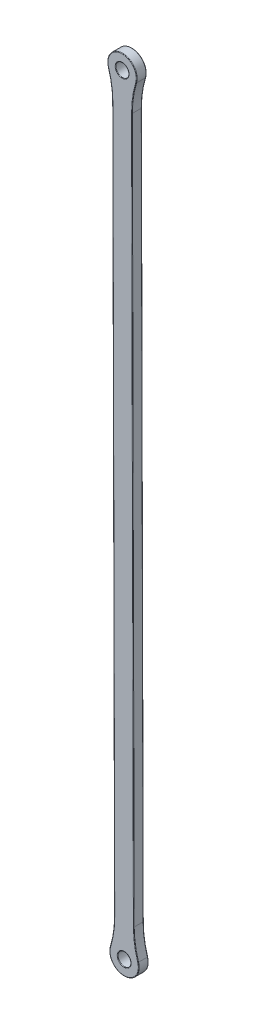
ISO-10303-21;
HEADER;
FILE_DESCRIPTION(('STEP AP214'),'2;1');
FILE_NAME('part.step','',(''),(''),'','','');
FILE_SCHEMA(('AUTOMOTIVE_DESIGN { 1 0 10303 214 1 1 1 1 }'));
ENDSEC;
DATA;
#1=APPLICATION_CONTEXT('core data for automotive mechanical design processes');
#2=APPLICATION_PROTOCOL_DEFINITION('international standard','automotive_design',2000,#1);
#3=PRODUCT_CONTEXT('',#1,'mechanical');
#4=PRODUCT('Part','Part','',(#3));
#5=PRODUCT_RELATED_PRODUCT_CATEGORY('part','',(#4));
#6=PRODUCT_DEFINITION_FORMATION('','',#4);
#7=PRODUCT_DEFINITION_CONTEXT('part definition',#1,'design');
#8=PRODUCT_DEFINITION('design','',#6,#7);
#9=PRODUCT_DEFINITION_SHAPE('','',#8);
#10=(LENGTH_UNIT() NAMED_UNIT(*) SI_UNIT(.MILLI.,.METRE.));
#11=(NAMED_UNIT(*) PLANE_ANGLE_UNIT() SI_UNIT($,.RADIAN.));
#12=(NAMED_UNIT(*) SI_UNIT($,.STERADIAN.) SOLID_ANGLE_UNIT());
#13=UNCERTAINTY_MEASURE_WITH_UNIT(LENGTH_MEASURE(1.E-05),#10,'distance_accuracy_value','');
#14=(GEOMETRIC_REPRESENTATION_CONTEXT(3) GLOBAL_UNCERTAINTY_ASSIGNED_CONTEXT((#13)) GLOBAL_UNIT_ASSIGNED_CONTEXT((#10,
#11,#12)) REPRESENTATION_CONTEXT('',''));
#15=CARTESIAN_POINT('',(0.,0.,0.));
#16=DIRECTION('',(0.,0.,1.));
#17=DIRECTION('',(1.,0.,0.));
#18=AXIS2_PLACEMENT_3D('',#15,#16,#17);
#19=CARTESIAN_POINT('',(11.4805483064947,0.0304454842710999,-3.));
#20=DIRECTION('',(0.999996483681336,0.00265190968255863,0.));
#21=DIRECTION('',(-0.00265190968255863,0.999996483681336,0.));
#22=AXIS2_PLACEMENT_3D('',#19,#20,#21);
#23=PLANE('',#22);
#24=DIRECTION('',(0.,0.,1.));
#25=VECTOR('',#24,1.);
#26=CARTESIAN_POINT('',(11.473326205843,2.75379436149719,-3.));
#27=LINE('',#26,#25);
#28=CARTESIAN_POINT('',(11.473326205843,2.75379436149719,-2.85));
#29=VERTEX_POINT('',#28);
#30=CARTESIAN_POINT('',(11.473326205843,2.75379436149719,-0.15));
#31=VERTEX_POINT('',#30);
#32=EDGE_CURVE('E302',#29,#31,#27,.T.);
#33=ORIENTED_EDGE('',*,*,#32,.T.);
#34=DIRECTION('',(-0.00265190968255863,0.999996483681336,0.));
#35=VECTOR('',#34,1.);
#36=CARTESIAN_POINT('',(10.8987204377385,219.429253328547,-0.15));
#37=LINE('',#36,#35);
#38=CARTESIAN_POINT('',(10.8987204377385,219.429253328547,-0.15));
#39=VERTEX_POINT('',#38);
#40=EDGE_CURVE('E209',#31,#39,#37,.T.);
#41=ORIENTED_EDGE('',*,*,#40,.T.);
#42=DIRECTION('',(0.,0.,1.));
#43=VECTOR('',#42,1.);
#44=CARTESIAN_POINT('',(10.8987204377385,219.429253328547,-3.));
#45=LINE('',#44,#43);
#46=CARTESIAN_POINT('',(10.8987204377385,219.429253328547,-2.85));
#47=VERTEX_POINT('',#46);
#48=EDGE_CURVE('E296',#39,#47,#45,.F.);
#49=ORIENTED_EDGE('',*,*,#48,.T.);
#50=DIRECTION('',(-0.00265190968255863,0.999996483681336,0.));
#51=VECTOR('',#50,1.);
#52=CARTESIAN_POINT('',(11.4805483064947,0.0304454842710999,-2.85));
#53=LINE('',#52,#51);
#54=EDGE_CURVE('E207',#47,#29,#53,.F.);
#55=ORIENTED_EDGE('',*,*,#54,.T.);
#56=EDGE_LOOP('',(#33,#41,#49,#55));
#57=FACE_BOUND('',#56,.T.);
#58=ADVANCED_FACE('F34',(#57),#23,.F.);
#59=CARTESIAN_POINT('',(13.8720255623407,229.49947957407,-3.));
#60=DIRECTION('',(0.,0.,1.));
#61=DIRECTION('',(1.,0.,0.));
#62=AXIS2_PLACEMENT_3D('',#59,#60,#61);
#63=CYLINDRICAL_SURFACE('',#62,4.50000000000002);
#64=DIRECTION('',(0.,0.,1.));
#65=VECTOR('',#64,1.);
#66=CARTESIAN_POINT('',(9.57117343603082,228.175594765026,-3.));
#67=LINE('',#66,#65);
#68=CARTESIAN_POINT('',(9.57117343603082,228.175594765026,-2.85));
#69=VERTEX_POINT('',#68);
#70=CARTESIAN_POINT('',(9.57117343603082,228.175594765026,-0.15));
#71=VERTEX_POINT('',#70);
#72=EDGE_CURVE('E298',#69,#71,#67,.T.);
#73=ORIENTED_EDGE('',*,*,#72,.T.);
#74=CARTESIAN_POINT('',(13.8720255623407,229.49947957407,-0.15));
#75=DIRECTION('',(0.,0.,1.));
#76=DIRECTION('',(1.,0.,0.));
#77=AXIS2_PLACEMENT_3D('',#74,#75,#76);
#78=CIRCLE('',#77,4.50000000000002);
#79=CARTESIAN_POINT('',(18.1798388172876,228.198424248381,-0.15));
#80=VERTEX_POINT('',#79);
#81=EDGE_CURVE('E184',#71,#80,#78,.F.);
#82=ORIENTED_EDGE('',*,*,#81,.T.);
#83=DIRECTION('',(0.,0.,1.));
#84=VECTOR('',#83,1.);
#85=CARTESIAN_POINT('',(18.1798388172876,228.198424248381,-3.));
#86=LINE('',#85,#84);
#87=CARTESIAN_POINT('',(18.1798388172876,228.198424248381,-2.85));
#88=VERTEX_POINT('',#87);
#89=EDGE_CURVE('E305',#80,#88,#86,.F.);
#90=ORIENTED_EDGE('',*,*,#89,.T.);
#91=CARTESIAN_POINT('',(13.8720255623407,229.49947957407,-2.85));
#92=DIRECTION('',(0.,0.,1.));
#93=DIRECTION('',(1.,0.,0.));
#94=AXIS2_PLACEMENT_3D('',#91,#92,#93);
#95=CIRCLE('',#94,4.50000000000002);
#96=EDGE_CURVE('E182',#88,#69,#95,.T.);
#97=ORIENTED_EDGE('',*,*,#96,.T.);
#98=EDGE_LOOP('',(#73,#82,#90,#97));
#99=FACE_BOUND('',#98,.T.);
#100=ADVANCED_FACE('F338',(#99),#63,.T.);
#101=CARTESIAN_POINT('',(17.4805272085827,0.046356942366452,-3.));
#102=DIRECTION('',(0.999996483681336,0.00265190968255864,0.));
#103=DIRECTION('',(-0.00265190968255864,0.999996483681336,0.));
#104=AXIS2_PLACEMENT_3D('',#101,#102,#103);
#105=PLANE('',#104);
#106=DIRECTION('',(0.,0.,-1.));
#107=VECTOR('',#106,1.);
#108=CARTESIAN_POINT('',(16.8986993398265,219.445164786642,0.));
#109=LINE('',#108,#107);
#110=CARTESIAN_POINT('',(16.8986993398265,219.445164786642,-2.85));
#111=VERTEX_POINT('',#110);
#112=CARTESIAN_POINT('',(16.8986993398265,219.445164786642,-0.15));
#113=VERTEX_POINT('',#112);
#114=EDGE_CURVE('E308',#111,#113,#109,.F.);
#115=ORIENTED_EDGE('',*,*,#114,.T.);
#116=DIRECTION('',(-0.00265190968255864,0.999996483681336,0.));
#117=VECTOR('',#116,1.);
#118=CARTESIAN_POINT('',(17.4805272085827,0.046356942366452,-0.15));
#119=LINE('',#118,#117);
#120=CARTESIAN_POINT('',(17.473305107931,2.76970581959246,-0.15));
#121=VERTEX_POINT('',#120);
#122=EDGE_CURVE('E192',#113,#121,#119,.F.);
#123=ORIENTED_EDGE('',*,*,#122,.T.);
#124=DIRECTION('',(0.,0.,-1.));
#125=VECTOR('',#124,1.);
#126=CARTESIAN_POINT('',(17.473305107931,2.76970581959246,-3.));
#127=LINE('',#126,#125);
#128=CARTESIAN_POINT('',(17.473305107931,2.76970581959246,-2.85));
#129=VERTEX_POINT('',#128);
#130=EDGE_CURVE('E303',#121,#129,#127,.T.);
#131=ORIENTED_EDGE('',*,*,#130,.T.);
#132=DIRECTION('',(-0.00265190968255864,0.999996483681336,0.));
#133=VECTOR('',#132,1.);
#134=CARTESIAN_POINT('',(16.8986993398265,219.445164786642,-2.85));
#135=LINE('',#134,#133);
#136=EDGE_CURVE('E190',#129,#111,#135,.T.);
#137=ORIENTED_EDGE('',*,*,#136,.T.);
#138=EDGE_LOOP('',(#115,#123,#131,#137));
#139=FACE_BOUND('',#138,.T.);
#140=ADVANCED_FACE('F382',(#139),#105,.T.);
#141=CARTESIAN_POINT('',(13.8720255623407,229.49947957407,-3.));
#142=DIRECTION('',(0.,0.,1.));
#143=DIRECTION('',(1.,0.,0.));
#144=AXIS2_PLACEMENT_3D('',#141,#142,#143);
#145=CYLINDRICAL_SURFACE('',#144,2.);
#146=CARTESIAN_POINT('',(13.8720255623407,229.49947957407,-0.15));
#147=DIRECTION('',(0.,0.,1.));
#148=DIRECTION('',(1.,0.,0.));
#149=AXIS2_PLACEMENT_3D('',#146,#147,#148);
#150=CIRCLE('',#149,2.);
#151=CARTESIAN_POINT('',(15.8720255623407,229.49947957407,-0.15));
#152=VERTEX_POINT('',#151);
#153=EDGE_CURVE('E214',#152,#152,#150,.T.);
#154=ORIENTED_EDGE('',*,*,#153,.T.);
#155=EDGE_LOOP('',(#154));
#156=FACE_BOUND('',#155,.T.);
#157=CARTESIAN_POINT('',(13.8720255623407,229.49947957407,-2.85));
#158=DIRECTION('',(0.,0.,1.));
#159=DIRECTION('',(1.,0.,0.));
#160=AXIS2_PLACEMENT_3D('',#157,#158,#159);
#161=CIRCLE('',#160,2.);
#162=CARTESIAN_POINT('',(15.8720255623407,229.49947957407,-2.85));
#163=VERTEX_POINT('',#162);
#164=EDGE_CURVE('E211',#163,#163,#161,.F.);
#165=ORIENTED_EDGE('',*,*,#164,.T.);
#166=EDGE_LOOP('',(#165));
#167=FACE_BOUND('',#166,.T.);
#168=ADVANCED_FACE('F415',(#156,#167),#145,.F.);
#169=CARTESIAN_POINT('',(14.4999999833287,-7.30052042593024,-3.));
#170=DIRECTION('',(0.,0.,1.));
#171=DIRECTION('',(1.,0.,0.));
#172=AXIS2_PLACEMENT_3D('',#169,#170,#171);
#173=CYLINDRICAL_SURFACE('',#172,2.);
#174=CARTESIAN_POINT('',(14.4999999833287,-7.30052042593024,-0.15));
#175=DIRECTION('',(0.,0.,1.));
#176=DIRECTION('',(1.,0.,0.));
#177=AXIS2_PLACEMENT_3D('',#174,#175,#176);
#178=CIRCLE('',#177,2.);
#179=CARTESIAN_POINT('',(16.4999999833287,-7.30052042593024,-0.15));
#180=VERTEX_POINT('',#179);
#181=EDGE_CURVE('E220',#180,#180,#178,.T.);
#182=ORIENTED_EDGE('',*,*,#181,.T.);
#183=EDGE_LOOP('',(#182));
#184=FACE_BOUND('',#183,.T.);
#185=CARTESIAN_POINT('',(14.4999999833287,-7.30052042593024,-2.85));
#186=DIRECTION('',(0.,0.,1.));
#187=DIRECTION('',(1.,0.,0.));
#188=AXIS2_PLACEMENT_3D('',#185,#186,#187);
#189=CIRCLE('',#188,2.);
#190=CARTESIAN_POINT('',(16.4999999833287,-7.30052042593024,-2.85));
#191=VERTEX_POINT('',#190);
#192=EDGE_CURVE('E217',#191,#191,#189,.F.);
#193=ORIENTED_EDGE('',*,*,#192,.T.);
#194=EDGE_LOOP('',(#193));
#195=FACE_BOUND('',#194,.T.);
#196=ADVANCED_FACE('F418',(#184,#195),#173,.F.);
#197=CARTESIAN_POINT('',(14.4999999833287,-7.30052042593024,-3.));
#198=DIRECTION('',(0.,0.,1.));
#199=DIRECTION('',(1.,0.,0.));
#200=AXIS2_PLACEMENT_3D('',#197,#198,#199);
#201=CYLINDRICAL_SURFACE('',#200,4.50000000000001);
#202=DIRECTION('',(0.,0.,1.));
#203=VECTOR('',#202,1.);
#204=CARTESIAN_POINT('',(18.8008521096386,-5.97663561688683,-3.));
#205=LINE('',#204,#203);
#206=CARTESIAN_POINT('',(18.8008521096386,-5.97663561688683,-2.85));
#207=VERTEX_POINT('',#206);
#208=CARTESIAN_POINT('',(18.8008521096386,-5.97663561688683,-0.15));
#209=VERTEX_POINT('',#208);
#210=EDGE_CURVE('E371',#207,#209,#205,.T.);
#211=ORIENTED_EDGE('',*,*,#210,.T.);
#212=CARTESIAN_POINT('',(14.4999999833287,-7.30052042593024,-0.15));
#213=DIRECTION('',(0.,0.,1.));
#214=DIRECTION('',(1.,0.,0.));
#215=AXIS2_PLACEMENT_3D('',#212,#213,#214);
#216=CIRCLE('',#215,4.50000000000001);
#217=CARTESIAN_POINT('',(10.1921867283819,-5.99946510024102,-0.15));
#218=VERTEX_POINT('',#217);
#219=EDGE_CURVE('E201',#209,#218,#216,.F.);
#220=ORIENTED_EDGE('',*,*,#219,.T.);
#221=DIRECTION('',(0.,0.,1.));
#222=VECTOR('',#221,1.);
#223=CARTESIAN_POINT('',(10.1921867283819,-5.99946510024102,-3.));
#224=LINE('',#223,#222);
#225=CARTESIAN_POINT('',(10.1921867283819,-5.99946510024102,-2.85));
#226=VERTEX_POINT('',#225);
#227=EDGE_CURVE('E258',#218,#226,#224,.F.);
#228=ORIENTED_EDGE('',*,*,#227,.T.);
#229=CARTESIAN_POINT('',(14.4999999833287,-7.30052042593024,-2.85));
#230=DIRECTION('',(0.,0.,1.));
#231=DIRECTION('',(1.,0.,0.));
#232=AXIS2_PLACEMENT_3D('',#229,#230,#231);
#233=CIRCLE('',#232,4.50000000000001);
#234=EDGE_CURVE('E199',#226,#207,#233,.T.);
#235=ORIENTED_EDGE('',*,*,#234,.T.);
#236=EDGE_LOOP('',(#211,#220,#228,#235));
#237=FACE_BOUND('',#236,.T.);
#238=ADVANCED_FACE('F370',(#237),#201,.T.);
#239=CARTESIAN_POINT('',(0.,0.,-3.));
#240=DIRECTION('',(0.,0.,1.));
#241=DIRECTION('',(1.,0.,0.));
#242=AXIS2_PLACEMENT_3D('',#239,#240,#241);
#243=PLANE('',#242);
#244=DIRECTION('',(-0.00265190968255864,0.999996483681336,0.));
#245=VECTOR('',#244,1.);
#246=CARTESIAN_POINT('',(17.3233056353788,2.76930803314008,-3.));
#247=LINE('',#246,#245);
#248=CARTESIAN_POINT('',(16.7486998672743,219.44476700019,-3.));
#249=VERTEX_POINT('',#248);
#250=CARTESIAN_POINT('',(17.3233056353788,2.76930803314008,-3.));
#251=VERTEX_POINT('',#250);
#252=EDGE_CURVE('E43',#249,#251,#247,.F.);
#253=ORIENTED_EDGE('',*,*,#252,.T.);
#254=CARTESIAN_POINT('',(47.4731996183711,2.84926311006922,-3.));
#255=DIRECTION('',(0.,0.,1.));
#256=DIRECTION('',(1.,0.,0.));
#257=AXIS2_PLACEMENT_3D('',#254,#255,#256);
#258=CIRCLE('',#257,30.15);
#259=CARTESIAN_POINT('',(18.657490372095,-6.02076511052161,-3.));
#260=VERTEX_POINT('',#259);
#261=EDGE_CURVE('E11',#251,#260,#258,.T.);
#262=ORIENTED_EDGE('',*,*,#261,.T.);
#263=CARTESIAN_POINT('',(14.4999999833287,-7.30052042593024,-3.));
#264=DIRECTION('',(0.,0.,1.));
#265=DIRECTION('',(1.,0.,0.));
#266=AXIS2_PLACEMENT_3D('',#263,#264,#265);
#267=CIRCLE('',#266,4.35000000000001);
#268=CARTESIAN_POINT('',(10.3357805035468,-6.04283361109733,-3.));
#269=VERTEX_POINT('',#268);
#270=EDGE_CURVE('E229',#260,#269,#267,.F.);
#271=ORIENTED_EDGE('',*,*,#270,.T.);
#272=CARTESIAN_POINT('',(-18.5265683045971,2.67423707102044,-3.));
#273=DIRECTION('',(0.,0.,1.));
#274=DIRECTION('',(1.,0.,0.));
#275=AXIS2_PLACEMENT_3D('',#272,#273,#274);
#276=CIRCLE('',#275,30.15);
#277=CARTESIAN_POINT('',(11.6233256783952,2.75419214794958,-3.));
#278=VERTEX_POINT('',#277);
#279=EDGE_CURVE('E231',#269,#278,#276,.T.);
#280=ORIENTED_EDGE('',*,*,#279,.T.);
#281=DIRECTION('',(-0.00265190968255863,0.999996483681336,0.));
#282=VECTOR('',#281,1.);
#283=CARTESIAN_POINT('',(11.6305477790469,0.0308432707234837,-3.));
#284=LINE('',#283,#282);
#285=CARTESIAN_POINT('',(11.0487199102907,219.429651114999,-3.));
#286=VERTEX_POINT('',#285);
#287=EDGE_CURVE('E233',#278,#286,#284,.T.);
#288=ORIENTED_EDGE('',*,*,#287,.T.);
#289=CARTESIAN_POINT('',(-19.1011740727016,219.34969603807,-3.));
#290=DIRECTION('',(0.,0.,1.));
#291=DIRECTION('',(1.,0.,0.));
#292=AXIS2_PLACEMENT_3D('',#289,#290,#291);
#293=CIRCLE('',#292,30.15);
#294=CARTESIAN_POINT('',(9.71453517357448,228.219724258661,-3.));
#295=VERTEX_POINT('',#294);
#296=EDGE_CURVE('E235',#286,#295,#293,.T.);
#297=ORIENTED_EDGE('',*,*,#296,.T.);
#298=CARTESIAN_POINT('',(13.8720255623407,229.49947957407,-3.));
#299=DIRECTION('',(0.,0.,1.));
#300=DIRECTION('',(1.,0.,0.));
#301=AXIS2_PLACEMENT_3D('',#298,#299,#300);
#302=CIRCLE('',#301,4.35000000000002);
#303=CARTESIAN_POINT('',(18.0362450421227,228.241792759237,-3.));
#304=VERTEX_POINT('',#303);
#305=EDGE_CURVE('E237',#295,#304,#302,.F.);
#306=ORIENTED_EDGE('',*,*,#305,.T.);
#307=CARTESIAN_POINT('',(46.8985938502665,219.524722077119,-3.));
#308=DIRECTION('',(0.,0.,1.));
#309=DIRECTION('',(1.,0.,0.));
#310=AXIS2_PLACEMENT_3D('',#307,#308,#309);
#311=CIRCLE('',#310,30.15);
#312=EDGE_CURVE('E54',#304,#249,#311,.T.);
#313=ORIENTED_EDGE('',*,*,#312,.T.);
#314=EDGE_LOOP('',(#253,#262,#271,#280,#288,#297,#306,#313));
#315=FACE_BOUND('',#314,.T.);
#316=CARTESIAN_POINT('',(13.8720255623407,229.49947957407,-3.));
#317=DIRECTION('',(0.,0.,1.));
#318=DIRECTION('',(1.,0.,0.));
#319=AXIS2_PLACEMENT_3D('',#316,#317,#318);
#320=CIRCLE('',#319,2.15);
#321=CARTESIAN_POINT('',(16.0220255623407,229.49947957407,-3.));
#322=VERTEX_POINT('',#321);
#323=EDGE_CURVE('E226',#322,#322,#320,.T.);
#324=ORIENTED_EDGE('',*,*,#323,.T.);
#325=EDGE_LOOP('',(#324));
#326=FACE_BOUND('',#325,.T.);
#327=CARTESIAN_POINT('',(14.4999999833287,-7.30052042593024,-3.));
#328=DIRECTION('',(0.,0.,1.));
#329=DIRECTION('',(1.,0.,0.));
#330=AXIS2_PLACEMENT_3D('',#327,#328,#329);
#331=CIRCLE('',#330,2.15);
#332=CARTESIAN_POINT('',(16.6499999833287,-7.30052042593024,-3.));
#333=VERTEX_POINT('',#332);
#334=EDGE_CURVE('E223',#333,#333,#331,.T.);
#335=ORIENTED_EDGE('',*,*,#334,.T.);
#336=EDGE_LOOP('',(#335));
#337=FACE_BOUND('',#336,.T.);
#338=ADVANCED_FACE('F355',(#315,#326,#337),#243,.F.);
#339=CARTESIAN_POINT('',(0.,0.,0.));
#340=DIRECTION('',(0.,0.,1.));
#341=DIRECTION('',(1.,0.,0.));
#342=AXIS2_PLACEMENT_3D('',#339,#340,#341);
#343=PLANE('',#342);
#344=CARTESIAN_POINT('',(13.8720255623407,229.49947957407,0.));
#345=DIRECTION('',(0.,0.,1.));
#346=DIRECTION('',(1.,0.,0.));
#347=AXIS2_PLACEMENT_3D('',#344,#345,#346);
#348=CIRCLE('',#347,4.35000000000002);
#349=CARTESIAN_POINT('',(18.0362450421227,228.241792759237,0.));
#350=VERTEX_POINT('',#349);
#351=CARTESIAN_POINT('',(9.71453517357448,228.219724258661,0.));
#352=VERTEX_POINT('',#351);
#353=EDGE_CURVE('E172',#350,#352,#348,.T.);
#354=ORIENTED_EDGE('',*,*,#353,.T.);
#355=CARTESIAN_POINT('',(-19.1011740727016,219.34969603807,0.));
#356=DIRECTION('',(0.,0.,1.));
#357=DIRECTION('',(1.,0.,0.));
#358=AXIS2_PLACEMENT_3D('',#355,#356,#357);
#359=CIRCLE('',#358,30.15);
#360=CARTESIAN_POINT('',(11.0487199102907,219.429651114999,0.));
#361=VERTEX_POINT('',#360);
#362=EDGE_CURVE('E152',#352,#361,#359,.F.);
#363=ORIENTED_EDGE('',*,*,#362,.T.);
#364=DIRECTION('',(-0.00265190968255863,0.999996483681336,0.));
#365=VECTOR('',#364,1.);
#366=CARTESIAN_POINT('',(11.6233256783952,2.75419214794958,0.));
#367=LINE('',#366,#365);
#368=CARTESIAN_POINT('',(11.6233256783952,2.75419214794958,0.));
#369=VERTEX_POINT('',#368);
#370=EDGE_CURVE('E160',#361,#369,#367,.F.);
#371=ORIENTED_EDGE('',*,*,#370,.T.);
#372=CARTESIAN_POINT('',(-18.5265683045971,2.67423707102044,0.));
#373=DIRECTION('',(0.,0.,1.));
#374=DIRECTION('',(1.,0.,0.));
#375=AXIS2_PLACEMENT_3D('',#372,#373,#374);
#376=CIRCLE('',#375,30.15);
#377=CARTESIAN_POINT('',(10.3357805035468,-6.04283361109733,0.));
#378=VERTEX_POINT('',#377);
#379=EDGE_CURVE('E166',#369,#378,#376,.F.);
#380=ORIENTED_EDGE('',*,*,#379,.T.);
#381=CARTESIAN_POINT('',(14.4999999833287,-7.30052042593024,0.));
#382=DIRECTION('',(0.,0.,1.));
#383=DIRECTION('',(1.,0.,0.));
#384=AXIS2_PLACEMENT_3D('',#381,#382,#383);
#385=CIRCLE('',#384,4.35000000000001);
#386=CARTESIAN_POINT('',(18.657490372095,-6.02076511052161,0.));
#387=VERTEX_POINT('',#386);
#388=EDGE_CURVE('E321',#378,#387,#385,.T.);
#389=ORIENTED_EDGE('',*,*,#388,.T.);
#390=CARTESIAN_POINT('',(47.4731996183711,2.84926311006922,0.));
#391=DIRECTION('',(0.,0.,1.));
#392=DIRECTION('',(1.,0.,0.));
#393=AXIS2_PLACEMENT_3D('',#390,#391,#392);
#394=CIRCLE('',#393,30.15);
#395=CARTESIAN_POINT('',(17.3233056353788,2.76930803314008,0.));
#396=VERTEX_POINT('',#395);
#397=EDGE_CURVE('E323',#387,#396,#394,.F.);
#398=ORIENTED_EDGE('',*,*,#397,.T.);
#399=DIRECTION('',(-0.00265190968255864,0.999996483681336,0.));
#400=VECTOR('',#399,1.);
#401=CARTESIAN_POINT('',(17.3305277360305,0.0459591559140682,0.));
#402=LINE('',#401,#400);
#403=CARTESIAN_POINT('',(16.7486998672743,219.44476700019,0.));
#404=VERTEX_POINT('',#403);
#405=EDGE_CURVE('E325',#396,#404,#402,.T.);
#406=ORIENTED_EDGE('',*,*,#405,.T.);
#407=CARTESIAN_POINT('',(46.8985938502665,219.524722077119,0.));
#408=DIRECTION('',(0.,0.,1.));
#409=DIRECTION('',(1.,0.,0.));
#410=AXIS2_PLACEMENT_3D('',#407,#408,#409);
#411=CIRCLE('',#410,30.15);
#412=EDGE_CURVE('E177',#404,#350,#411,.F.);
#413=ORIENTED_EDGE('',*,*,#412,.T.);
#414=EDGE_LOOP('',(#354,#363,#371,#380,#389,#398,#406,#413));
#415=FACE_BOUND('',#414,.T.);
#416=CARTESIAN_POINT('',(13.8720255623407,229.49947957407,0.));
#417=DIRECTION('',(0.,0.,1.));
#418=DIRECTION('',(1.,0.,0.));
#419=AXIS2_PLACEMENT_3D('',#416,#417,#418);
#420=CIRCLE('',#419,2.15);
#421=CARTESIAN_POINT('',(16.0220255623407,229.49947957407,0.));
#422=VERTEX_POINT('',#421);
#423=EDGE_CURVE('E167',#422,#422,#420,.F.);
#424=ORIENTED_EDGE('',*,*,#423,.T.);
#425=EDGE_LOOP('',(#424));
#426=FACE_BOUND('',#425,.T.);
#427=CARTESIAN_POINT('',(14.4999999833287,-7.30052042593024,0.));
#428=DIRECTION('',(0.,0.,1.));
#429=DIRECTION('',(1.,0.,0.));
#430=AXIS2_PLACEMENT_3D('',#427,#428,#429);
#431=CIRCLE('',#430,2.15);
#432=CARTESIAN_POINT('',(16.6499999833287,-7.30052042593024,0.));
#433=VERTEX_POINT('',#432);
#434=EDGE_CURVE('E315',#433,#433,#431,.F.);
#435=ORIENTED_EDGE('',*,*,#434,.T.);
#436=EDGE_LOOP('',(#435));
#437=FACE_BOUND('',#436,.T.);
#438=ADVANCED_FACE('F169',(#415,#426,#437),#343,.T.);
#439=CARTESIAN_POINT('',(47.4731996183711,2.84926311006922,-3.));
#440=DIRECTION('',(0.,0.,1.));
#441=DIRECTION('',(1.,0.,0.));
#442=AXIS2_PLACEMENT_3D('',#439,#440,#441);
#443=CYLINDRICAL_SURFACE('',#442,30.);
#444=ORIENTED_EDGE('',*,*,#130,.F.);
#445=CARTESIAN_POINT('',(47.4731996183711,2.84926311006922,-0.15));
#446=DIRECTION('',(0.,0.,1.));
#447=DIRECTION('',(1.,0.,0.));
#448=AXIS2_PLACEMENT_3D('',#445,#446,#447);
#449=CIRCLE('',#448,30.);
#450=EDGE_CURVE('E197',#121,#209,#449,.T.);
#451=ORIENTED_EDGE('',*,*,#450,.T.);
#452=ORIENTED_EDGE('',*,*,#210,.F.);
#453=CARTESIAN_POINT('',(47.4731996183711,2.84926311006922,-2.85));
#454=DIRECTION('',(0.,0.,1.));
#455=DIRECTION('',(1.,0.,0.));
#456=AXIS2_PLACEMENT_3D('',#453,#454,#455);
#457=CIRCLE('',#456,30.);
#458=EDGE_CURVE('E194',#207,#129,#457,.F.);
#459=ORIENTED_EDGE('',*,*,#458,.T.);
#460=EDGE_LOOP('',(#444,#451,#452,#459));
#461=FACE_BOUND('',#460,.T.);
#462=ADVANCED_FACE('F376',(#461),#443,.F.);
#463=CARTESIAN_POINT('',(-18.5265683045971,2.67423707102044,-3.));
#464=DIRECTION('',(0.,0.,1.));
#465=DIRECTION('',(1.,0.,0.));
#466=AXIS2_PLACEMENT_3D('',#463,#464,#465);
#467=CYLINDRICAL_SURFACE('',#466,30.);
#468=ORIENTED_EDGE('',*,*,#227,.F.);
#469=CARTESIAN_POINT('',(-18.5265683045971,2.67423707102044,-0.15));
#470=DIRECTION('',(0.,0.,1.));
#471=DIRECTION('',(1.,0.,0.));
#472=AXIS2_PLACEMENT_3D('',#469,#470,#471);
#473=CIRCLE('',#472,30.);
#474=EDGE_CURVE('E205',#218,#31,#473,.T.);
#475=ORIENTED_EDGE('',*,*,#474,.T.);
#476=ORIENTED_EDGE('',*,*,#32,.F.);
#477=CARTESIAN_POINT('',(-18.5265683045971,2.67423707102044,-2.85));
#478=DIRECTION('',(0.,0.,1.));
#479=DIRECTION('',(1.,0.,0.));
#480=AXIS2_PLACEMENT_3D('',#477,#478,#479);
#481=CIRCLE('',#480,30.);
#482=EDGE_CURVE('E203',#29,#226,#481,.F.);
#483=ORIENTED_EDGE('',*,*,#482,.T.);
#484=EDGE_LOOP('',(#468,#475,#476,#483));
#485=FACE_BOUND('',#484,.T.);
#486=ADVANCED_FACE('F396',(#485),#467,.F.);
#487=CARTESIAN_POINT('',(-19.1011740727016,219.34969603807,-3.));
#488=DIRECTION('',(0.,0.,1.));
#489=DIRECTION('',(1.,0.,0.));
#490=AXIS2_PLACEMENT_3D('',#487,#488,#489);
#491=CYLINDRICAL_SURFACE('',#490,30.);
#492=ORIENTED_EDGE('',*,*,#48,.F.);
#493=CARTESIAN_POINT('',(-19.1011740727016,219.34969603807,-0.15));
#494=DIRECTION('',(0.,0.,1.));
#495=DIRECTION('',(1.,0.,0.));
#496=AXIS2_PLACEMENT_3D('',#493,#494,#495);
#497=CIRCLE('',#496,30.);
#498=EDGE_CURVE('E154',#39,#71,#497,.T.);
#499=ORIENTED_EDGE('',*,*,#498,.T.);
#500=ORIENTED_EDGE('',*,*,#72,.F.);
#501=CARTESIAN_POINT('',(-19.1011740727016,219.34969603807,-2.85));
#502=DIRECTION('',(0.,0.,1.));
#503=DIRECTION('',(1.,0.,0.));
#504=AXIS2_PLACEMENT_3D('',#501,#502,#503);
#505=CIRCLE('',#504,30.);
#506=EDGE_CURVE('E174',#69,#47,#505,.F.);
#507=ORIENTED_EDGE('',*,*,#506,.T.);
#508=EDGE_LOOP('',(#492,#499,#500,#507));
#509=FACE_BOUND('',#508,.T.);
#510=ADVANCED_FACE('F295',(#509),#491,.F.);
#511=CARTESIAN_POINT('',(46.8985938502665,219.524722077119,-3.));
#512=DIRECTION('',(0.,0.,1.));
#513=DIRECTION('',(1.,0.,0.));
#514=AXIS2_PLACEMENT_3D('',#511,#512,#513);
#515=CYLINDRICAL_SURFACE('',#514,30.);
#516=ORIENTED_EDGE('',*,*,#89,.F.);
#517=CARTESIAN_POINT('',(46.8985938502665,219.524722077119,-0.15));
#518=DIRECTION('',(0.,0.,1.));
#519=DIRECTION('',(1.,0.,0.));
#520=AXIS2_PLACEMENT_3D('',#517,#518,#519);
#521=CIRCLE('',#520,30.);
#522=EDGE_CURVE('E188',#80,#113,#521,.T.);
#523=ORIENTED_EDGE('',*,*,#522,.T.);
#524=ORIENTED_EDGE('',*,*,#114,.F.);
#525=CARTESIAN_POINT('',(46.8985938502665,219.524722077119,-2.85));
#526=DIRECTION('',(0.,0.,1.));
#527=DIRECTION('',(1.,0.,0.));
#528=AXIS2_PLACEMENT_3D('',#525,#526,#527);
#529=CIRCLE('',#528,30.);
#530=EDGE_CURVE('E186',#111,#88,#529,.F.);
#531=ORIENTED_EDGE('',*,*,#530,.T.);
#532=EDGE_LOOP('',(#516,#523,#524,#531));
#533=FACE_BOUND('',#532,.T.);
#534=ADVANCED_FACE('F340',(#533),#515,.F.);
#535=CARTESIAN_POINT('',(47.4731996183711,2.84926311006922,-0.15));
#536=DIRECTION('',(0.,0.,1.));
#537=DIRECTION('',(1.,0.,0.));
#538=AXIS2_PLACEMENT_3D('',#535,#536,#537);
#539=TOROIDAL_SURFACE('',#538,30.15,0.15);
#540=CARTESIAN_POINT('',(18.657490372095,-6.02076511052161,-0.15));
#541=DIRECTION('',(0.294196624231866,-0.955744916957749,0.));
#542=DIRECTION('',(0.955744916957749,0.294196624231866,0.));
#543=AXIS2_PLACEMENT_3D('',#540,#541,#542);
#544=CIRCLE('',#543,0.15);
#545=EDGE_CURVE('E252',#209,#387,#544,.T.);
#546=ORIENTED_EDGE('',*,*,#545,.F.);
#547=ORIENTED_EDGE('',*,*,#450,.F.);
#548=CARTESIAN_POINT('',(17.3233056353788,2.76930803314008,-0.15));
#549=DIRECTION('',(-0.00265190968255838,0.999996483681335,0.));
#550=DIRECTION('',(-0.999996483681336,-0.00265190968255838,0.));
#551=AXIS2_PLACEMENT_3D('',#548,#549,#550);
#552=CIRCLE('',#551,0.15);
#553=EDGE_CURVE('E255',#396,#121,#552,.T.);
#554=ORIENTED_EDGE('',*,*,#553,.F.);
#555=ORIENTED_EDGE('',*,*,#397,.F.);
#556=EDGE_LOOP('',(#546,#547,#554,#555));
#557=FACE_BOUND('',#556,.T.);
#558=ADVANCED_FACE('F388',(#557),#539,.T.);
#559=CARTESIAN_POINT('',(17.3305277360305,0.0459591559140682,-0.15));
#560=DIRECTION('',(-0.00265190968255864,0.999996483681336,0.));
#561=DIRECTION('',(-0.999996483681336,-0.00265190968255864,0.));
#562=AXIS2_PLACEMENT_3D('',#559,#560,#561);
#563=CYLINDRICAL_SURFACE('',#562,0.15);
#564=ORIENTED_EDGE('',*,*,#553,.T.);
#565=ORIENTED_EDGE('',*,*,#122,.F.);
#566=CARTESIAN_POINT('',(16.7486998672743,219.44476700019,-0.15));
#567=DIRECTION('',(-0.00265190968259024,0.999996483681335,0.));
#568=DIRECTION('',(-0.999996483681336,-0.00265190968259024,0.));
#569=AXIS2_PLACEMENT_3D('',#566,#567,#568);
#570=CIRCLE('',#569,0.15);
#571=EDGE_CURVE('E249',#404,#113,#570,.T.);
#572=ORIENTED_EDGE('',*,*,#571,.F.);
#573=ORIENTED_EDGE('',*,*,#405,.F.);
#574=EDGE_LOOP('',(#564,#565,#572,#573));
#575=FACE_BOUND('',#574,.T.);
#576=ADVANCED_FACE('F384',(#575),#563,.T.);
#577=CARTESIAN_POINT('',(14.4999999833287,-7.30052042593024,-0.15));
#578=DIRECTION('',(0.,0.,1.));
#579=DIRECTION('',(1.,0.,0.));
#580=AXIS2_PLACEMENT_3D('',#577,#578,#579);
#581=TOROIDAL_SURFACE('',#580,4.35000000000001,0.15);
#582=ORIENTED_EDGE('',*,*,#545,.T.);
#583=ORIENTED_EDGE('',*,*,#388,.F.);
#584=CARTESIAN_POINT('',(10.3357805035468,-6.04283361109733,-0.15));
#585=DIRECTION('',(0.289123405708714,0.957291834432632,0.));
#586=DIRECTION('',(-0.957291834432633,0.289123405708714,0.));
#587=AXIS2_PLACEMENT_3D('',#584,#585,#586);
#588=CIRCLE('',#587,0.15);
#589=EDGE_CURVE('E246',#218,#378,#588,.T.);
#590=ORIENTED_EDGE('',*,*,#589,.F.);
#591=ORIENTED_EDGE('',*,*,#219,.F.);
#592=EDGE_LOOP('',(#582,#583,#590,#591));
#593=FACE_BOUND('',#592,.T.);
#594=ADVANCED_FACE('F393',(#593),#581,.T.);
#595=CARTESIAN_POINT('',(46.8985938502665,219.524722077119,-0.15));
#596=DIRECTION('',(0.,0.,1.));
#597=DIRECTION('',(1.,0.,0.));
#598=AXIS2_PLACEMENT_3D('',#595,#596,#597);
#599=TOROIDAL_SURFACE('',#598,30.15,0.15);
#600=ORIENTED_EDGE('',*,*,#571,.T.);
#601=ORIENTED_EDGE('',*,*,#522,.F.);
#602=CARTESIAN_POINT('',(18.0362450421227,228.241792759237,-0.15));
#603=DIRECTION('',(0.289123405708784,0.957291834432611,0.));
#604=DIRECTION('',(-0.957291834432611,0.289123405708784,0.));
#605=AXIS2_PLACEMENT_3D('',#602,#603,#604);
#606=CIRCLE('',#605,0.15);
#607=EDGE_CURVE('E243',#350,#80,#606,.T.);
#608=ORIENTED_EDGE('',*,*,#607,.F.);
#609=ORIENTED_EDGE('',*,*,#412,.F.);
#610=EDGE_LOOP('',(#600,#601,#608,#609));
#611=FACE_BOUND('',#610,.T.);
#612=ADVANCED_FACE('F332',(#611),#599,.T.);
#613=CARTESIAN_POINT('',(-18.5265683045971,2.67423707102044,-0.15));
#614=DIRECTION('',(0.,0.,1.));
#615=DIRECTION('',(1.,0.,0.));
#616=AXIS2_PLACEMENT_3D('',#613,#614,#615);
#617=TOROIDAL_SURFACE('',#616,30.15,0.15);
#618=ORIENTED_EDGE('',*,*,#589,.T.);
#619=ORIENTED_EDGE('',*,*,#379,.F.);
#620=CARTESIAN_POINT('',(11.6233256783952,2.75419214794958,-0.15));
#621=DIRECTION('',(-0.00265190968255838,0.999996483681336,0.));
#622=DIRECTION('',(-0.999996483681336,-0.00265190968255838,0.));
#623=AXIS2_PLACEMENT_3D('',#620,#621,#622);
#624=CIRCLE('',#623,0.15);
#625=EDGE_CURVE('E163',#31,#369,#624,.T.);
#626=ORIENTED_EDGE('',*,*,#625,.F.);
#627=ORIENTED_EDGE('',*,*,#474,.F.);
#628=EDGE_LOOP('',(#618,#619,#626,#627));
#629=FACE_BOUND('',#628,.T.);
#630=ADVANCED_FACE('F438',(#629),#617,.T.);
#631=CARTESIAN_POINT('',(13.8720255623407,229.49947957407,-0.15));
#632=DIRECTION('',(0.,0.,1.));
#633=DIRECTION('',(1.,0.,0.));
#634=AXIS2_PLACEMENT_3D('',#631,#632,#633);
#635=TOROIDAL_SURFACE('',#634,4.35000000000002,0.15);
#636=ORIENTED_EDGE('',*,*,#607,.T.);
#637=ORIENTED_EDGE('',*,*,#81,.F.);
#638=CARTESIAN_POINT('',(9.71453517357448,228.219724258661,-0.15));
#639=DIRECTION('',(0.294196624231836,-0.955744916957758,0.));
#640=DIRECTION('',(0.955744916957758,0.294196624231836,0.));
#641=AXIS2_PLACEMENT_3D('',#638,#639,#640);
#642=CIRCLE('',#641,0.15);
#643=EDGE_CURVE('E157',#352,#71,#642,.T.);
#644=ORIENTED_EDGE('',*,*,#643,.F.);
#645=ORIENTED_EDGE('',*,*,#353,.F.);
#646=EDGE_LOOP('',(#636,#637,#644,#645));
#647=FACE_BOUND('',#646,.T.);
#648=ADVANCED_FACE('F335',(#647),#635,.T.);
#649=CARTESIAN_POINT('',(11.6305477790469,0.0308432707234837,-0.15));
#650=DIRECTION('',(0.00265190968255863,-0.999996483681336,0.));
#651=DIRECTION('',(0.999996483681336,0.00265190968255863,0.));
#652=AXIS2_PLACEMENT_3D('',#649,#650,#651);
#653=CYLINDRICAL_SURFACE('',#652,0.15);
#654=ORIENTED_EDGE('',*,*,#625,.T.);
#655=ORIENTED_EDGE('',*,*,#370,.F.);
#656=CARTESIAN_POINT('',(11.0487199102907,219.429651114999,-0.15));
#657=DIRECTION('',(-0.00265190968259018,0.999996483681335,0.));
#658=DIRECTION('',(-0.999996483681336,-0.00265190968259018,0.));
#659=AXIS2_PLACEMENT_3D('',#656,#657,#658);
#660=CIRCLE('',#659,0.15);
#661=EDGE_CURVE('E148',#39,#361,#660,.T.);
#662=ORIENTED_EDGE('',*,*,#661,.F.);
#663=ORIENTED_EDGE('',*,*,#40,.F.);
#664=EDGE_LOOP('',(#654,#655,#662,#663));
#665=FACE_BOUND('',#664,.T.);
#666=ADVANCED_FACE('F161',(#665),#653,.T.);
#667=CARTESIAN_POINT('',(-19.1011740727016,219.34969603807,-0.15));
#668=DIRECTION('',(0.,0.,1.));
#669=DIRECTION('',(1.,0.,0.));
#670=AXIS2_PLACEMENT_3D('',#667,#668,#669);
#671=TOROIDAL_SURFACE('',#670,30.15,0.15);
#672=ORIENTED_EDGE('',*,*,#643,.T.);
#673=ORIENTED_EDGE('',*,*,#498,.F.);
#674=ORIENTED_EDGE('',*,*,#661,.T.);
#675=ORIENTED_EDGE('',*,*,#362,.F.);
#676=EDGE_LOOP('',(#672,#673,#674,#675));
#677=FACE_BOUND('',#676,.T.);
#678=ADVANCED_FACE('F150',(#677),#671,.T.);
#679=CARTESIAN_POINT('',(13.8720255623407,229.49947957407,-0.15));
#680=DIRECTION('',(0.,0.,1.));
#681=DIRECTION('',(1.,0.,0.));
#682=AXIS2_PLACEMENT_3D('',#679,#680,#681);
#683=TOROIDAL_SURFACE('',#682,2.15,0.15);
#684=ORIENTED_EDGE('',*,*,#423,.F.);
#685=EDGE_LOOP('',(#684));
#686=FACE_BOUND('',#685,.T.);
#687=ORIENTED_EDGE('',*,*,#153,.F.);
#688=EDGE_LOOP('',(#687));
#689=FACE_BOUND('',#688,.T.);
#690=ADVANCED_FACE('F433',(#686,#689),#683,.T.);
#691=CARTESIAN_POINT('',(14.4999999833287,-7.30052042593024,-0.15));
#692=DIRECTION('',(0.,0.,1.));
#693=DIRECTION('',(1.,0.,0.));
#694=AXIS2_PLACEMENT_3D('',#691,#692,#693);
#695=TOROIDAL_SURFACE('',#694,2.15,0.15);
#696=ORIENTED_EDGE('',*,*,#434,.F.);
#697=EDGE_LOOP('',(#696));
#698=FACE_BOUND('',#697,.T.);
#699=ORIENTED_EDGE('',*,*,#181,.F.);
#700=EDGE_LOOP('',(#699));
#701=FACE_BOUND('',#700,.T.);
#702=ADVANCED_FACE('F452',(#698,#701),#695,.T.);
#703=CARTESIAN_POINT('',(-19.1011740727016,219.34969603807,-2.85));
#704=DIRECTION('',(0.,0.,1.));
#705=DIRECTION('',(1.,0.,0.));
#706=AXIS2_PLACEMENT_3D('',#703,#704,#705);
#707=TOROIDAL_SURFACE('',#706,30.15,0.15);
#708=CARTESIAN_POINT('',(11.0487199102907,219.429651114999,-2.85));
#709=DIRECTION('',(0.00265190968259018,-0.999996483681335,0.));
#710=DIRECTION('',(0.999996483681336,0.00265190968259018,0.));
#711=AXIS2_PLACEMENT_3D('',#708,#709,#710);
#712=CIRCLE('',#711,0.15);
#713=EDGE_CURVE('E274',#47,#286,#712,.T.);
#714=ORIENTED_EDGE('',*,*,#713,.F.);
#715=ORIENTED_EDGE('',*,*,#506,.F.);
#716=CARTESIAN_POINT('',(9.71453517357448,228.219724258661,-2.85));
#717=DIRECTION('',(-0.29419662423184,0.955744916957757,0.));
#718=DIRECTION('',(-0.955744916957757,-0.29419662423184,0.));
#719=AXIS2_PLACEMENT_3D('',#716,#717,#718);
#720=CIRCLE('',#719,0.15);
#721=EDGE_CURVE('E38',#295,#69,#720,.T.);
#722=ORIENTED_EDGE('',*,*,#721,.F.);
#723=ORIENTED_EDGE('',*,*,#296,.F.);
#724=EDGE_LOOP('',(#714,#715,#722,#723));
#725=FACE_BOUND('',#724,.T.);
#726=ADVANCED_FACE('F290',(#725),#707,.T.);
#727=CARTESIAN_POINT('',(13.8720255623407,229.49947957407,-2.85));
#728=DIRECTION('',(0.,0.,1.));
#729=DIRECTION('',(1.,0.,0.));
#730=AXIS2_PLACEMENT_3D('',#727,#728,#729);
#731=TOROIDAL_SURFACE('',#730,4.35000000000002,0.15);
#732=ORIENTED_EDGE('',*,*,#721,.T.);
#733=ORIENTED_EDGE('',*,*,#96,.F.);
#734=CARTESIAN_POINT('',(18.0362450421227,228.241792759237,-2.85));
#735=DIRECTION('',(-0.289123405708784,-0.957291834432611,0.));
#736=DIRECTION('',(0.957291834432611,-0.289123405708784,0.));
#737=AXIS2_PLACEMENT_3D('',#734,#735,#736);
#738=CIRCLE('',#737,0.15);
#739=EDGE_CURVE('E272',#304,#88,#738,.T.);
#740=ORIENTED_EDGE('',*,*,#739,.F.);
#741=ORIENTED_EDGE('',*,*,#305,.F.);
#742=EDGE_LOOP('',(#732,#733,#740,#741));
#743=FACE_BOUND('',#742,.T.);
#744=ADVANCED_FACE('F285',(#743),#731,.T.);
#745=CARTESIAN_POINT('',(11.6305477790469,0.0308432707234837,-2.85));
#746=DIRECTION('',(-0.00265190968255863,0.999996483681336,0.));
#747=DIRECTION('',(-0.999996483681336,-0.00265190968255863,0.));
#748=AXIS2_PLACEMENT_3D('',#745,#746,#747);
#749=CYLINDRICAL_SURFACE('',#748,0.15);
#750=ORIENTED_EDGE('',*,*,#713,.T.);
#751=ORIENTED_EDGE('',*,*,#287,.F.);
#752=CARTESIAN_POINT('',(11.6233256783952,2.75419214794958,-2.85));
#753=DIRECTION('',(0.00265190968255838,-0.999996483681336,0.));
#754=DIRECTION('',(0.999996483681336,0.00265190968255838,0.));
#755=AXIS2_PLACEMENT_3D('',#752,#753,#754);
#756=CIRCLE('',#755,0.15);
#757=EDGE_CURVE('E269',#29,#278,#756,.T.);
#758=ORIENTED_EDGE('',*,*,#757,.F.);
#759=ORIENTED_EDGE('',*,*,#54,.F.);
#760=EDGE_LOOP('',(#750,#751,#758,#759));
#761=FACE_BOUND('',#760,.T.);
#762=ADVANCED_FACE('F397',(#761),#749,.T.);
#763=CARTESIAN_POINT('',(46.8985938502665,219.524722077119,-2.85));
#764=DIRECTION('',(0.,0.,1.));
#765=DIRECTION('',(1.,0.,0.));
#766=AXIS2_PLACEMENT_3D('',#763,#764,#765);
#767=TOROIDAL_SURFACE('',#766,30.15,0.15);
#768=ORIENTED_EDGE('',*,*,#739,.T.);
#769=ORIENTED_EDGE('',*,*,#530,.F.);
#770=CARTESIAN_POINT('',(16.7486998672743,219.44476700019,-2.85));
#771=DIRECTION('',(0.00265190968259012,-0.999996483681336,0.));
#772=DIRECTION('',(0.999996483681335,0.00265190968259012,0.));
#773=AXIS2_PLACEMENT_3D('',#770,#771,#772);
#774=CIRCLE('',#773,0.15);
#775=EDGE_CURVE('E266',#249,#111,#774,.T.);
#776=ORIENTED_EDGE('',*,*,#775,.F.);
#777=ORIENTED_EDGE('',*,*,#312,.F.);
#778=EDGE_LOOP('',(#768,#769,#776,#777));
#779=FACE_BOUND('',#778,.T.);
#780=ADVANCED_FACE('F345',(#779),#767,.T.);
#781=CARTESIAN_POINT('',(-18.5265683045971,2.67423707102044,-2.85));
#782=DIRECTION('',(0.,0.,1.));
#783=DIRECTION('',(1.,0.,0.));
#784=AXIS2_PLACEMENT_3D('',#781,#782,#783);
#785=TOROIDAL_SURFACE('',#784,30.15,0.15);
#786=ORIENTED_EDGE('',*,*,#757,.T.);
#787=ORIENTED_EDGE('',*,*,#279,.F.);
#788=CARTESIAN_POINT('',(10.3357805035468,-6.04283361109733,-2.85));
#789=DIRECTION('',(-0.289123405708714,-0.957291834432632,0.));
#790=DIRECTION('',(0.957291834432633,-0.289123405708714,0.));
#791=AXIS2_PLACEMENT_3D('',#788,#789,#790);
#792=CIRCLE('',#791,0.15);
#793=EDGE_CURVE('E263',#226,#269,#792,.T.);
#794=ORIENTED_EDGE('',*,*,#793,.F.);
#795=ORIENTED_EDGE('',*,*,#482,.F.);
#796=EDGE_LOOP('',(#786,#787,#794,#795));
#797=FACE_BOUND('',#796,.T.);
#798=ADVANCED_FACE('F361',(#797),#785,.T.);
#799=CARTESIAN_POINT('',(17.3305277360305,0.0459591559140682,-2.85));
#800=DIRECTION('',(0.00265190968255864,-0.999996483681336,0.));
#801=DIRECTION('',(0.999996483681336,0.00265190968255864,0.));
#802=AXIS2_PLACEMENT_3D('',#799,#800,#801);
#803=CYLINDRICAL_SURFACE('',#802,0.15);
#804=ORIENTED_EDGE('',*,*,#775,.T.);
#805=ORIENTED_EDGE('',*,*,#136,.F.);
#806=CARTESIAN_POINT('',(17.3233056353788,2.76930803314008,-2.85));
#807=DIRECTION('',(0.00265190968255838,-0.999996483681336,0.));
#808=DIRECTION('',(0.999996483681336,0.00265190968255838,0.));
#809=AXIS2_PLACEMENT_3D('',#806,#807,#808);
#810=CIRCLE('',#809,0.15);
#811=EDGE_CURVE('E261',#251,#129,#810,.T.);
#812=ORIENTED_EDGE('',*,*,#811,.F.);
#813=ORIENTED_EDGE('',*,*,#252,.F.);
#814=EDGE_LOOP('',(#804,#805,#812,#813));
#815=FACE_BOUND('',#814,.T.);
#816=ADVANCED_FACE('F348',(#815),#803,.T.);
#817=CARTESIAN_POINT('',(14.4999999833287,-7.30052042593024,-2.85));
#818=DIRECTION('',(0.,0.,1.));
#819=DIRECTION('',(1.,0.,0.));
#820=AXIS2_PLACEMENT_3D('',#817,#818,#819);
#821=TOROIDAL_SURFACE('',#820,4.35000000000001,0.15);
#822=ORIENTED_EDGE('',*,*,#793,.T.);
#823=ORIENTED_EDGE('',*,*,#270,.F.);
#824=CARTESIAN_POINT('',(18.657490372095,-6.02076511052161,-2.85));
#825=DIRECTION('',(-0.294196624231866,0.955744916957749,0.));
#826=DIRECTION('',(-0.955744916957749,-0.294196624231866,0.));
#827=AXIS2_PLACEMENT_3D('',#824,#825,#826);
#828=CIRCLE('',#827,0.15);
#829=EDGE_CURVE('E259',#207,#260,#828,.T.);
#830=ORIENTED_EDGE('',*,*,#829,.F.);
#831=ORIENTED_EDGE('',*,*,#234,.F.);
#832=EDGE_LOOP('',(#822,#823,#830,#831));
#833=FACE_BOUND('',#832,.T.);
#834=ADVANCED_FACE('F365',(#833),#821,.T.);
#835=CARTESIAN_POINT('',(47.4731996183711,2.84926311006922,-2.85));
#836=DIRECTION('',(0.,0.,1.));
#837=DIRECTION('',(1.,0.,0.));
#838=AXIS2_PLACEMENT_3D('',#835,#836,#837);
#839=TOROIDAL_SURFACE('',#838,30.15,0.15);
#840=ORIENTED_EDGE('',*,*,#811,.T.);
#841=ORIENTED_EDGE('',*,*,#458,.F.);
#842=ORIENTED_EDGE('',*,*,#829,.T.);
#843=ORIENTED_EDGE('',*,*,#261,.F.);
#844=EDGE_LOOP('',(#840,#841,#842,#843));
#845=FACE_BOUND('',#844,.T.);
#846=ADVANCED_FACE('F352',(#845),#839,.T.);
#847=CARTESIAN_POINT('',(13.8720255623407,229.49947957407,-2.85));
#848=DIRECTION('',(0.,0.,1.));
#849=DIRECTION('',(1.,0.,0.));
#850=AXIS2_PLACEMENT_3D('',#847,#848,#849);
#851=TOROIDAL_SURFACE('',#850,2.15,0.15);
#852=ORIENTED_EDGE('',*,*,#164,.F.);
#853=EDGE_LOOP('',(#852));
#854=FACE_BOUND('',#853,.T.);
#855=ORIENTED_EDGE('',*,*,#323,.F.);
#856=EDGE_LOOP('',(#855));
#857=FACE_BOUND('',#856,.T.);
#858=ADVANCED_FACE('F459',(#854,#857),#851,.T.);
#859=CARTESIAN_POINT('',(14.4999999833287,-7.30052042593024,-2.85));
#860=DIRECTION('',(0.,0.,1.));
#861=DIRECTION('',(1.,0.,0.));
#862=AXIS2_PLACEMENT_3D('',#859,#860,#861);
#863=TOROIDAL_SURFACE('',#862,2.15,0.15);
#864=ORIENTED_EDGE('',*,*,#192,.F.);
#865=EDGE_LOOP('',(#864));
#866=FACE_BOUND('',#865,.T.);
#867=ORIENTED_EDGE('',*,*,#334,.F.);
#868=EDGE_LOOP('',(#867));
#869=FACE_BOUND('',#868,.T.);
#870=ADVANCED_FACE('F36',(#866,#869),#863,.T.);
#871=CLOSED_SHELL('',(#58,#100,#140,#168,#196,#238,#338,#438,#462,#486,#510,#534,#558,#576,#594,
#612,#630,#648,#666,#678,#690,#702,#726,#744,#762,#780,#798,#816,#834,#846,#858,#870));
#872=MANIFOLD_SOLID_BREP('B2',#871);
#873=ADVANCED_BREP_SHAPE_REPRESENTATION('',(#18,#872),#14);
#874=SHAPE_DEFINITION_REPRESENTATION(#9,#873);
ENDSEC;
END-ISO-10303-21;
